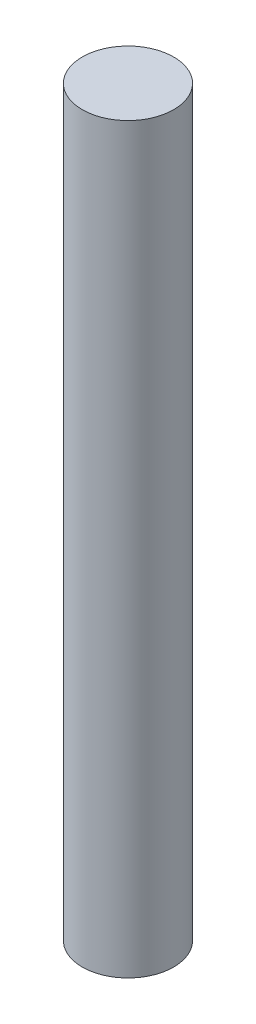
ISO-10303-21;
HEADER;
FILE_DESCRIPTION(('STEP AP214'),'2;1');
FILE_NAME('part.step','',(''),(''),'','','');
FILE_SCHEMA(('AUTOMOTIVE_DESIGN { 1 0 10303 214 1 1 1 1 }'));
ENDSEC;
DATA;
#1=APPLICATION_CONTEXT('core data for automotive mechanical design processes');
#2=APPLICATION_PROTOCOL_DEFINITION('international standard','automotive_design',2000,#1);
#3=PRODUCT_CONTEXT('',#1,'mechanical');
#4=PRODUCT('Part','Part','',(#3));
#5=PRODUCT_RELATED_PRODUCT_CATEGORY('part','',(#4));
#6=PRODUCT_DEFINITION_FORMATION('','',#4);
#7=PRODUCT_DEFINITION_CONTEXT('part definition',#1,'design');
#8=PRODUCT_DEFINITION('design','',#6,#7);
#9=PRODUCT_DEFINITION_SHAPE('','',#8);
#10=(LENGTH_UNIT() NAMED_UNIT(*) SI_UNIT(.MILLI.,.METRE.));
#11=(NAMED_UNIT(*) PLANE_ANGLE_UNIT() SI_UNIT($,.RADIAN.));
#12=(NAMED_UNIT(*) SI_UNIT($,.STERADIAN.) SOLID_ANGLE_UNIT());
#13=UNCERTAINTY_MEASURE_WITH_UNIT(LENGTH_MEASURE(1.E-05),#10,'distance_accuracy_value','');
#14=(GEOMETRIC_REPRESENTATION_CONTEXT(3) GLOBAL_UNCERTAINTY_ASSIGNED_CONTEXT((#13)) GLOBAL_UNIT_ASSIGNED_CONTEXT((#10,
#11,#12)) REPRESENTATION_CONTEXT('',''));
#15=CARTESIAN_POINT('',(0.,0.,0.));
#16=DIRECTION('',(0.,0.,1.));
#17=DIRECTION('',(1.,0.,0.));
#18=AXIS2_PLACEMENT_3D('',#15,#16,#17);
#19=CARTESIAN_POINT('',(-9.6049158961442,32.5,10.2521198991407));
#20=DIRECTION('',(0.,-1.,0.));
#21=DIRECTION('',(0.,0.,-1.));
#22=AXIS2_PLACEMENT_3D('',#19,#20,#21);
#23=CYLINDRICAL_SURFACE('',#22,2.);
#24=CARTESIAN_POINT('',(-9.6049158961442,32.5,10.2521198991407));
#25=DIRECTION('',(0.,1.,0.));
#26=DIRECTION('',(0.,0.,1.));
#27=AXIS2_PLACEMENT_3D('',#24,#25,#26);
#28=CIRCLE('',#27,2.);
#29=CARTESIAN_POINT('',(-9.6049158961442,32.5,12.2521198991407));
#30=VERTEX_POINT('',#29);
#31=EDGE_CURVE('E10',#30,#30,#28,.T.);
#32=ORIENTED_EDGE('',*,*,#31,.F.);
#33=EDGE_LOOP('',(#32));
#34=FACE_BOUND('',#33,.T.);
#35=CARTESIAN_POINT('',(-9.6049158961442,0.,10.2521198991407));
#36=DIRECTION('',(0.,1.,0.));
#37=DIRECTION('',(0.,0.,1.));
#38=AXIS2_PLACEMENT_3D('',#35,#36,#37);
#39=CIRCLE('',#38,2.);
#40=CARTESIAN_POINT('',(-9.6049158961442,0.,12.2521198991407));
#41=VERTEX_POINT('',#40);
#42=EDGE_CURVE('E44',#41,#41,#39,.T.);
#43=ORIENTED_EDGE('',*,*,#42,.T.);
#44=EDGE_LOOP('',(#43));
#45=FACE_BOUND('',#44,.T.);
#46=ADVANCED_FACE('F41',(#34,#45),#23,.T.);
#47=CARTESIAN_POINT('',(-9.6049158961442,32.5,10.2521198991407));
#48=DIRECTION('',(0.,1.,0.));
#49=DIRECTION('',(0.,0.,1.));
#50=AXIS2_PLACEMENT_3D('',#47,#48,#49);
#51=PLANE('',#50);
#52=ORIENTED_EDGE('',*,*,#31,.T.);
#53=EDGE_LOOP('',(#52));
#54=FACE_BOUND('',#53,.T.);
#55=ADVANCED_FACE('F58',(#54),#51,.T.);
#56=CARTESIAN_POINT('',(-9.6049158961442,0.,10.2521198991407));
#57=DIRECTION('',(0.,1.,0.));
#58=DIRECTION('',(0.,0.,1.));
#59=AXIS2_PLACEMENT_3D('',#56,#57,#58);
#60=PLANE('',#59);
#61=ORIENTED_EDGE('',*,*,#42,.F.);
#62=EDGE_LOOP('',(#61));
#63=FACE_BOUND('',#62,.T.);
#64=ADVANCED_FACE('F56',(#63),#60,.F.);
#65=CLOSED_SHELL('',(#46,#55,#64));
#66=MANIFOLD_SOLID_BREP('B2',#65);
#67=ADVANCED_BREP_SHAPE_REPRESENTATION('',(#18,#66),#14);
#68=SHAPE_DEFINITION_REPRESENTATION(#9,#67);
ENDSEC;
END-ISO-10303-21;
